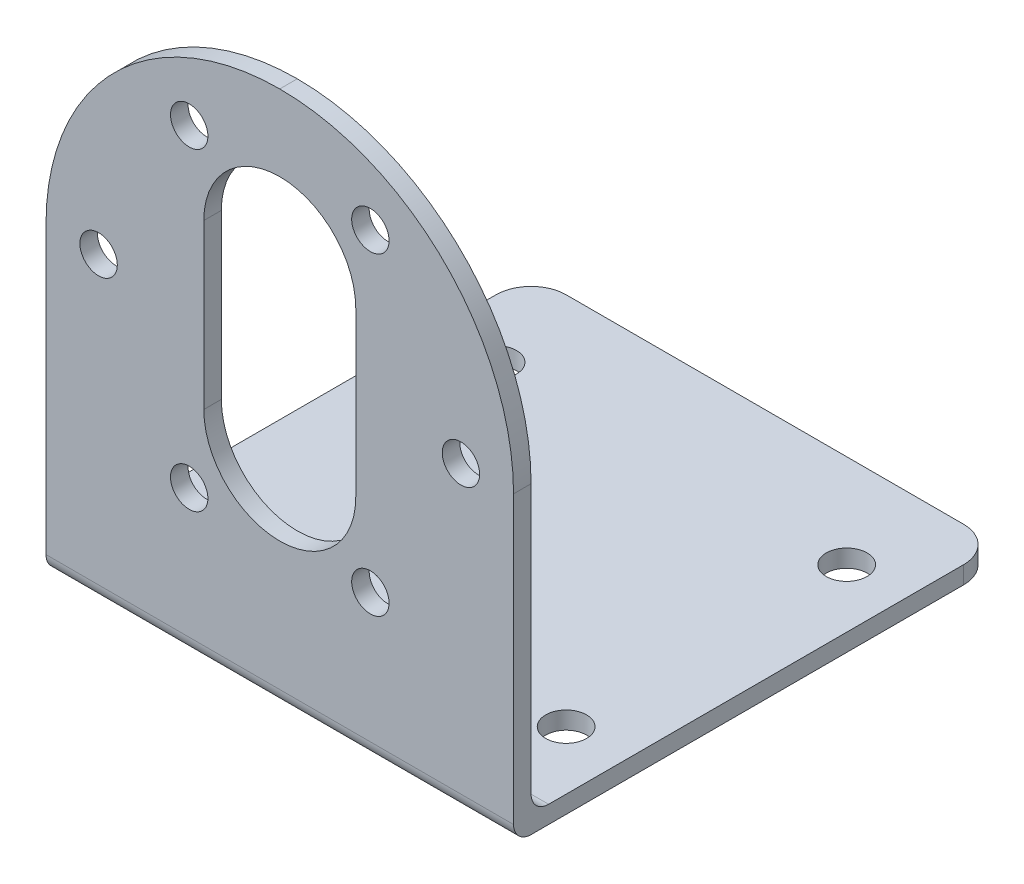
ISO-10303-21;
HEADER;
FILE_DESCRIPTION(('STEP AP214'),'2;1');
FILE_NAME('part.step','',(''),(''),'','','');
FILE_SCHEMA(('AUTOMOTIVE_DESIGN { 1 0 10303 214 1 1 1 1 }'));
ENDSEC;
DATA;
#1=APPLICATION_CONTEXT('core data for automotive mechanical design processes');
#2=APPLICATION_PROTOCOL_DEFINITION('international standard','automotive_design',2000,#1);
#3=PRODUCT_CONTEXT('',#1,'mechanical');
#4=PRODUCT('Part','Part','',(#3));
#5=PRODUCT_RELATED_PRODUCT_CATEGORY('part','',(#4));
#6=PRODUCT_DEFINITION_FORMATION('','',#4);
#7=PRODUCT_DEFINITION_CONTEXT('part definition',#1,'design');
#8=PRODUCT_DEFINITION('design','',#6,#7);
#9=PRODUCT_DEFINITION_SHAPE('','',#8);
#10=(LENGTH_UNIT() NAMED_UNIT(*) SI_UNIT(.MILLI.,.METRE.));
#11=(NAMED_UNIT(*) PLANE_ANGLE_UNIT() SI_UNIT($,.RADIAN.));
#12=(NAMED_UNIT(*) SI_UNIT($,.STERADIAN.) SOLID_ANGLE_UNIT());
#13=UNCERTAINTY_MEASURE_WITH_UNIT(LENGTH_MEASURE(1.E-05),#10,'distance_accuracy_value','');
#14=(GEOMETRIC_REPRESENTATION_CONTEXT(3) GLOBAL_UNCERTAINTY_ASSIGNED_CONTEXT((#13)) GLOBAL_UNIT_ASSIGNED_CONTEXT((#10,
#11,#12)) REPRESENTATION_CONTEXT('',''));
#15=CARTESIAN_POINT('',(0.,0.,0.));
#16=DIRECTION('',(0.,0.,1.));
#17=DIRECTION('',(1.,0.,0.));
#18=AXIS2_PLACEMENT_3D('',#15,#16,#17);
#19=CARTESIAN_POINT('',(40.,44.5,0.));
#20=DIRECTION('',(0.,0.,1.));
#21=DIRECTION('',(0.,-1.,0.));
#22=AXIS2_PLACEMENT_3D('',#19,#20,#21);
#23=PLANE('',#22);
#24=CARTESIAN_POINT('',(12.2499999999999,11.0766062413411,0.));
#25=DIRECTION('',(0.,0.,1.));
#26=DIRECTION('',(0.,-1.,0.));
#27=AXIS2_PLACEMENT_3D('',#24,#25,#26);
#28=CIRCLE('',#27,1.60000000000014);
#29=CARTESIAN_POINT('',(12.2499999999999,9.47660624134092,0.));
#30=VERTEX_POINT('',#29);
#31=EDGE_CURVE('E206',#30,#30,#28,.T.);
#32=ORIENTED_EDGE('',*,*,#31,.T.);
#33=EDGE_LOOP('',(#32));
#34=FACE_BOUND('',#33,.T.);
#35=CARTESIAN_POINT('',(27.7499999999999,11.0766062413411,0.));
#36=DIRECTION('',(0.,0.,1.));
#37=DIRECTION('',(0.,-1.,0.));
#38=AXIS2_PLACEMENT_3D('',#35,#36,#37);
#39=CIRCLE('',#38,1.6);
#40=CARTESIAN_POINT('',(27.7499999999999,9.47660624134106,0.));
#41=VERTEX_POINT('',#40);
#42=EDGE_CURVE('E203',#41,#41,#39,.T.);
#43=ORIENTED_EDGE('',*,*,#42,.T.);
#44=EDGE_LOOP('',(#43));
#45=FACE_BOUND('',#44,.T.);
#46=CARTESIAN_POINT('',(35.5,24.4999999999998,0.));
#47=DIRECTION('',(0.,0.,1.));
#48=DIRECTION('',(0.,-1.,0.));
#49=AXIS2_PLACEMENT_3D('',#46,#47,#48);
#50=CIRCLE('',#49,1.6);
#51=CARTESIAN_POINT('',(35.5,22.8999999999998,0.));
#52=VERTEX_POINT('',#51);
#53=EDGE_CURVE('E200',#52,#52,#50,.T.);
#54=ORIENTED_EDGE('',*,*,#53,.T.);
#55=EDGE_LOOP('',(#54));
#56=FACE_BOUND('',#55,.T.);
#57=CARTESIAN_POINT('',(27.7500000000001,37.9233937586587,0.));
#58=DIRECTION('',(0.,0.,1.));
#59=DIRECTION('',(0.,-1.,0.));
#60=AXIS2_PLACEMENT_3D('',#57,#58,#59);
#61=CIRCLE('',#60,1.6);
#62=CARTESIAN_POINT('',(27.7500000000001,36.3233937586587,0.));
#63=VERTEX_POINT('',#62);
#64=EDGE_CURVE('E197',#63,#63,#61,.T.);
#65=ORIENTED_EDGE('',*,*,#64,.T.);
#66=EDGE_LOOP('',(#65));
#67=FACE_BOUND('',#66,.T.);
#68=CARTESIAN_POINT('',(12.25,37.9233937586587,0.));
#69=DIRECTION('',(0.,0.,1.));
#70=DIRECTION('',(0.,-1.,0.));
#71=AXIS2_PLACEMENT_3D('',#68,#69,#70);
#72=CIRCLE('',#71,1.6);
#73=CARTESIAN_POINT('',(12.25,36.3233937586587,0.));
#74=VERTEX_POINT('',#73);
#75=EDGE_CURVE('E194',#74,#74,#72,.T.);
#76=ORIENTED_EDGE('',*,*,#75,.T.);
#77=EDGE_LOOP('',(#76));
#78=FACE_BOUND('',#77,.T.);
#79=CARTESIAN_POINT('',(4.49999999999993,24.4999999999999,0.));
#80=DIRECTION('',(0.,0.,1.));
#81=DIRECTION('',(0.,-1.,0.));
#82=AXIS2_PLACEMENT_3D('',#79,#80,#81);
#83=CIRCLE('',#82,1.60000000000009);
#84=CARTESIAN_POINT('',(4.49999999999993,22.8999999999998,0.));
#85=VERTEX_POINT('',#84);
#86=EDGE_CURVE('E191',#85,#85,#83,.T.);
#87=ORIENTED_EDGE('',*,*,#86,.T.);
#88=EDGE_LOOP('',(#87));
#89=FACE_BOUND('',#88,.T.);
#90=DIRECTION('',(0.,1.,0.));
#91=VECTOR('',#90,1.);
#92=CARTESIAN_POINT('',(26.5,44.5,0.));
#93=LINE('',#92,#91);
#94=CARTESIAN_POINT('',(26.5,17.5,0.));
#95=VERTEX_POINT('',#94);
#96=CARTESIAN_POINT('',(26.5,31.5,0.));
#97=VERTEX_POINT('',#96);
#98=EDGE_CURVE('E185',#95,#97,#93,.T.);
#99=ORIENTED_EDGE('',*,*,#98,.T.);
#100=CARTESIAN_POINT('',(20.,31.5,0.));
#101=DIRECTION('',(0.,0.,1.));
#102=DIRECTION('',(0.,-1.,0.));
#103=AXIS2_PLACEMENT_3D('',#100,#101,#102);
#104=CIRCLE('',#103,6.5);
#105=CARTESIAN_POINT('',(13.5,31.5,0.));
#106=VERTEX_POINT('',#105);
#107=EDGE_CURVE('E188',#97,#106,#104,.T.);
#108=ORIENTED_EDGE('',*,*,#107,.T.);
#109=DIRECTION('',(0.,-1.,0.));
#110=VECTOR('',#109,1.);
#111=CARTESIAN_POINT('',(13.5,44.5,0.));
#112=LINE('',#111,#110);
#113=CARTESIAN_POINT('',(13.5,17.5,0.));
#114=VERTEX_POINT('',#113);
#115=EDGE_CURVE('E180',#106,#114,#112,.T.);
#116=ORIENTED_EDGE('',*,*,#115,.T.);
#117=CARTESIAN_POINT('',(20.,17.5,0.));
#118=DIRECTION('',(0.,0.,1.));
#119=DIRECTION('',(0.,-1.,0.));
#120=AXIS2_PLACEMENT_3D('',#117,#118,#119);
#121=CIRCLE('',#120,6.5);
#122=EDGE_CURVE('E156',#114,#95,#121,.T.);
#123=ORIENTED_EDGE('',*,*,#122,.T.);
#124=EDGE_LOOP('',(#99,#108,#116,#123));
#125=FACE_BOUND('',#124,.T.);
#126=DIRECTION('',(0.,1.,0.));
#127=VECTOR('',#126,1.);
#128=CARTESIAN_POINT('',(40.,44.5,0.));
#129=LINE('',#128,#127);
#130=CARTESIAN_POINT('',(40.,1.5,0.));
#131=VERTEX_POINT('',#130);
#132=CARTESIAN_POINT('',(40.,24.5,0.));
#133=VERTEX_POINT('',#132);
#134=EDGE_CURVE('E223',#131,#133,#129,.T.);
#135=ORIENTED_EDGE('',*,*,#134,.F.);
#136=DIRECTION('',(-1.,0.,0.));
#137=VECTOR('',#136,1.);
#138=CARTESIAN_POINT('',(0.,1.5,0.));
#139=LINE('',#138,#137);
#140=CARTESIAN_POINT('',(0.,1.5,0.));
#141=VERTEX_POINT('',#140);
#142=EDGE_CURVE('E293',#131,#141,#139,.T.);
#143=ORIENTED_EDGE('',*,*,#142,.T.);
#144=DIRECTION('',(0.,1.,0.));
#145=VECTOR('',#144,1.);
#146=CARTESIAN_POINT('',(0.,44.5,0.));
#147=LINE('',#146,#145);
#148=CARTESIAN_POINT('',(0.,24.5,0.));
#149=VERTEX_POINT('',#148);
#150=EDGE_CURVE('E234',#141,#149,#147,.T.);
#151=ORIENTED_EDGE('',*,*,#150,.T.);
#152=CARTESIAN_POINT('',(20.,24.5,0.));
#153=DIRECTION('',(0.,0.,1.));
#154=DIRECTION('',(0.,-1.,0.));
#155=AXIS2_PLACEMENT_3D('',#152,#153,#154);
#156=CIRCLE('',#155,20.);
#157=CARTESIAN_POINT('',(20.,44.5,0.));
#158=VERTEX_POINT('',#157);
#159=EDGE_CURVE('E285',#149,#158,#156,.F.);
#160=ORIENTED_EDGE('',*,*,#159,.T.);
#161=CARTESIAN_POINT('',(20.,24.5,0.));
#162=DIRECTION('',(0.,0.,1.));
#163=DIRECTION('',(0.,-1.,0.));
#164=AXIS2_PLACEMENT_3D('',#161,#162,#163);
#165=CIRCLE('',#164,20.);
#166=EDGE_CURVE('E287',#158,#133,#165,.F.);
#167=ORIENTED_EDGE('',*,*,#166,.T.);
#168=EDGE_LOOP('',(#135,#143,#151,#160,#167));
#169=FACE_BOUND('',#168,.T.);
#170=ADVANCED_FACE('F40',(#34,#45,#56,#67,#78,#89,#125,#169),#23,.F.);
#171=CARTESIAN_POINT('',(40.,-1.5,1.5));
#172=DIRECTION('',(0.,0.,-1.));
#173=DIRECTION('',(-1.,0.,0.));
#174=AXIS2_PLACEMENT_3D('',#171,#172,#173);
#175=PLANE('',#174);
#176=CARTESIAN_POINT('',(12.2499999999999,11.0766062413411,1.5));
#177=DIRECTION('',(0.,0.,1.));
#178=DIRECTION('',(1.,0.,0.));
#179=AXIS2_PLACEMENT_3D('',#176,#177,#178);
#180=CIRCLE('',#179,1.60000000000014);
#181=CARTESIAN_POINT('',(13.8500000000001,11.0766062413411,1.5));
#182=VERTEX_POINT('',#181);
#183=EDGE_CURVE('E446',#182,#182,#180,.T.);
#184=ORIENTED_EDGE('',*,*,#183,.F.);
#185=EDGE_LOOP('',(#184));
#186=FACE_BOUND('',#185,.T.);
#187=CARTESIAN_POINT('',(27.7499999999999,11.0766062413411,1.5));
#188=DIRECTION('',(0.,0.,1.));
#189=DIRECTION('',(1.,0.,0.));
#190=AXIS2_PLACEMENT_3D('',#187,#188,#189);
#191=CIRCLE('',#190,1.6);
#192=CARTESIAN_POINT('',(29.3499999999999,11.0766062413411,1.5));
#193=VERTEX_POINT('',#192);
#194=EDGE_CURVE('E449',#193,#193,#191,.T.);
#195=ORIENTED_EDGE('',*,*,#194,.F.);
#196=EDGE_LOOP('',(#195));
#197=FACE_BOUND('',#196,.T.);
#198=CARTESIAN_POINT('',(35.5,24.4999999999998,1.5));
#199=DIRECTION('',(0.,0.,1.));
#200=DIRECTION('',(1.,0.,0.));
#201=AXIS2_PLACEMENT_3D('',#198,#199,#200);
#202=CIRCLE('',#201,1.6);
#203=CARTESIAN_POINT('',(37.1,24.4999999999998,1.5));
#204=VERTEX_POINT('',#203);
#205=EDGE_CURVE('E452',#204,#204,#202,.T.);
#206=ORIENTED_EDGE('',*,*,#205,.F.);
#207=EDGE_LOOP('',(#206));
#208=FACE_BOUND('',#207,.T.);
#209=CARTESIAN_POINT('',(27.7500000000001,37.9233937586587,1.5));
#210=DIRECTION('',(0.,0.,1.));
#211=DIRECTION('',(1.,0.,0.));
#212=AXIS2_PLACEMENT_3D('',#209,#210,#211);
#213=CIRCLE('',#212,1.6);
#214=CARTESIAN_POINT('',(29.3500000000001,37.9233937586587,1.5));
#215=VERTEX_POINT('',#214);
#216=EDGE_CURVE('E455',#215,#215,#213,.T.);
#217=ORIENTED_EDGE('',*,*,#216,.F.);
#218=EDGE_LOOP('',(#217));
#219=FACE_BOUND('',#218,.T.);
#220=CARTESIAN_POINT('',(12.25,37.9233937586587,1.5));
#221=DIRECTION('',(0.,0.,1.));
#222=DIRECTION('',(1.,0.,0.));
#223=AXIS2_PLACEMENT_3D('',#220,#221,#222);
#224=CIRCLE('',#223,1.6);
#225=CARTESIAN_POINT('',(13.85,37.9233937586587,1.5));
#226=VERTEX_POINT('',#225);
#227=EDGE_CURVE('E443',#226,#226,#224,.T.);
#228=ORIENTED_EDGE('',*,*,#227,.F.);
#229=EDGE_LOOP('',(#228));
#230=FACE_BOUND('',#229,.T.);
#231=CARTESIAN_POINT('',(4.49999999999993,24.4999999999999,1.5));
#232=DIRECTION('',(0.,0.,1.));
#233=DIRECTION('',(1.,0.,0.));
#234=AXIS2_PLACEMENT_3D('',#231,#232,#233);
#235=CIRCLE('',#234,1.60000000000009);
#236=CARTESIAN_POINT('',(6.10000000000002,24.4999999999999,1.5));
#237=VERTEX_POINT('',#236);
#238=EDGE_CURVE('E438',#237,#237,#235,.T.);
#239=ORIENTED_EDGE('',*,*,#238,.F.);
#240=EDGE_LOOP('',(#239));
#241=FACE_BOUND('',#240,.T.);
#242=DIRECTION('',(0.,-1.,0.));
#243=VECTOR('',#242,1.);
#244=CARTESIAN_POINT('',(13.5,31.5,1.5));
#245=LINE('',#244,#243);
#246=CARTESIAN_POINT('',(13.5,31.5,1.5));
#247=VERTEX_POINT('',#246);
#248=CARTESIAN_POINT('',(13.5,17.5,1.5));
#249=VERTEX_POINT('',#248);
#250=EDGE_CURVE('E164',#247,#249,#245,.T.);
#251=ORIENTED_EDGE('',*,*,#250,.F.);
#252=CARTESIAN_POINT('',(20.,31.5,1.5));
#253=DIRECTION('',(0.,0.,1.));
#254=DIRECTION('',(1.,0.,0.));
#255=AXIS2_PLACEMENT_3D('',#252,#253,#254);
#256=CIRCLE('',#255,6.5);
#257=CARTESIAN_POINT('',(26.5,31.5,1.5));
#258=VERTEX_POINT('',#257);
#259=EDGE_CURVE('E169',#258,#247,#256,.T.);
#260=ORIENTED_EDGE('',*,*,#259,.F.);
#261=DIRECTION('',(0.,1.,0.));
#262=VECTOR('',#261,1.);
#263=CARTESIAN_POINT('',(26.5,31.5,1.5));
#264=LINE('',#263,#262);
#265=CARTESIAN_POINT('',(26.5,17.5,1.5));
#266=VERTEX_POINT('',#265);
#267=EDGE_CURVE('E173',#266,#258,#264,.T.);
#268=ORIENTED_EDGE('',*,*,#267,.F.);
#269=CARTESIAN_POINT('',(20.,17.5,1.5));
#270=DIRECTION('',(0.,0.,1.));
#271=DIRECTION('',(-1.,0.,0.));
#272=AXIS2_PLACEMENT_3D('',#269,#270,#271);
#273=CIRCLE('',#272,6.5);
#274=EDGE_CURVE('E153',#249,#266,#273,.T.);
#275=ORIENTED_EDGE('',*,*,#274,.F.);
#276=EDGE_LOOP('',(#251,#260,#268,#275));
#277=FACE_BOUND('',#276,.T.);
#278=DIRECTION('',(0.,-1.,0.));
#279=VECTOR('',#278,1.);
#280=CARTESIAN_POINT('',(0.,-1.5,1.5));
#281=LINE('',#280,#279);
#282=CARTESIAN_POINT('',(0.,24.5,1.5));
#283=VERTEX_POINT('',#282);
#284=CARTESIAN_POINT('',(0.,0.,1.5));
#285=VERTEX_POINT('',#284);
#286=EDGE_CURVE('E236',#283,#285,#281,.T.);
#287=ORIENTED_EDGE('',*,*,#286,.T.);
#288=DIRECTION('',(-1.,0.,0.));
#289=VECTOR('',#288,1.);
#290=CARTESIAN_POINT('',(40.,0.,1.5));
#291=LINE('',#290,#289);
#292=CARTESIAN_POINT('',(40.,0.,1.5));
#293=VERTEX_POINT('',#292);
#294=EDGE_CURVE('E55',#285,#293,#291,.F.);
#295=ORIENTED_EDGE('',*,*,#294,.T.);
#296=DIRECTION('',(0.,-1.,0.));
#297=VECTOR('',#296,1.);
#298=CARTESIAN_POINT('',(40.,-1.5,1.5));
#299=LINE('',#298,#297);
#300=CARTESIAN_POINT('',(40.,24.5,1.5));
#301=VERTEX_POINT('',#300);
#302=EDGE_CURVE('E225',#301,#293,#299,.T.);
#303=ORIENTED_EDGE('',*,*,#302,.F.);
#304=CARTESIAN_POINT('',(20.,24.5,1.5));
#305=DIRECTION('',(0.,0.,-1.));
#306=DIRECTION('',(-1.,0.,0.));
#307=AXIS2_PLACEMENT_3D('',#304,#305,#306);
#308=CIRCLE('',#307,20.);
#309=CARTESIAN_POINT('',(20.,44.5,1.5));
#310=VERTEX_POINT('',#309);
#311=EDGE_CURVE('E283',#301,#310,#308,.F.);
#312=ORIENTED_EDGE('',*,*,#311,.T.);
#313=CARTESIAN_POINT('',(20.,24.5,1.5));
#314=DIRECTION('',(0.,0.,-1.));
#315=DIRECTION('',(-1.,0.,0.));
#316=AXIS2_PLACEMENT_3D('',#313,#314,#315);
#317=CIRCLE('',#316,20.);
#318=EDGE_CURVE('E281',#310,#283,#317,.F.);
#319=ORIENTED_EDGE('',*,*,#318,.T.);
#320=EDGE_LOOP('',(#287,#295,#303,#312,#319));
#321=FACE_BOUND('',#320,.T.);
#322=ADVANCED_FACE('F171',(#186,#197,#208,#219,#230,#241,#277,#321),#175,.F.);
#323=CARTESIAN_POINT('',(40.,-1.5,-40.));
#324=DIRECTION('',(0.,1.,0.));
#325=DIRECTION('',(0.,0.,1.));
#326=AXIS2_PLACEMENT_3D('',#323,#324,#325);
#327=PLANE('',#326);
#328=CARTESIAN_POINT('',(35.,-1.5,-32.));
#329=DIRECTION('',(0.,-1.,0.));
#330=DIRECTION('',(0.,0.,1.));
#331=AXIS2_PLACEMENT_3D('',#328,#329,#330);
#332=CIRCLE('',#331,1.75);
#333=CARTESIAN_POINT('',(35.,-1.5,-30.25));
#334=VERTEX_POINT('',#333);
#335=EDGE_CURVE('E217',#334,#334,#332,.T.);
#336=ORIENTED_EDGE('',*,*,#335,.F.);
#337=EDGE_LOOP('',(#336));
#338=FACE_BOUND('',#337,.T.);
#339=CARTESIAN_POINT('',(35.,-1.5,-8.));
#340=DIRECTION('',(0.,-1.,0.));
#341=DIRECTION('',(0.,0.,1.));
#342=AXIS2_PLACEMENT_3D('',#339,#340,#341);
#343=CIRCLE('',#342,1.75);
#344=CARTESIAN_POINT('',(35.,-1.5,-6.24999999999999));
#345=VERTEX_POINT('',#344);
#346=EDGE_CURVE('E214',#345,#345,#343,.T.);
#347=ORIENTED_EDGE('',*,*,#346,.F.);
#348=EDGE_LOOP('',(#347));
#349=FACE_BOUND('',#348,.T.);
#350=CARTESIAN_POINT('',(5.,-1.5,-8.));
#351=DIRECTION('',(0.,-1.,0.));
#352=DIRECTION('',(0.,0.,-1.));
#353=AXIS2_PLACEMENT_3D('',#350,#351,#352);
#354=CIRCLE('',#353,1.75);
#355=CARTESIAN_POINT('',(5.,-1.5,-9.75));
#356=VERTEX_POINT('',#355);
#357=EDGE_CURVE('E210',#356,#356,#354,.T.);
#358=ORIENTED_EDGE('',*,*,#357,.F.);
#359=EDGE_LOOP('',(#358));
#360=FACE_BOUND('',#359,.T.);
#361=CARTESIAN_POINT('',(5.,-1.5,-32.));
#362=DIRECTION('',(0.,-1.,0.));
#363=DIRECTION('',(0.,0.,-1.));
#364=AXIS2_PLACEMENT_3D('',#361,#362,#363);
#365=CIRCLE('',#364,1.75);
#366=CARTESIAN_POINT('',(5.,-1.5,-33.75));
#367=VERTEX_POINT('',#366);
#368=EDGE_CURVE('E213',#367,#367,#365,.T.);
#369=ORIENTED_EDGE('',*,*,#368,.F.);
#370=EDGE_LOOP('',(#369));
#371=FACE_BOUND('',#370,.T.);
#372=DIRECTION('',(0.,0.,-1.));
#373=VECTOR('',#372,1.);
#374=CARTESIAN_POINT('',(40.,-1.5,-40.));
#375=LINE('',#374,#373);
#376=CARTESIAN_POINT('',(40.,-1.5,0.));
#377=VERTEX_POINT('',#376);
#378=CARTESIAN_POINT('',(40.,-1.5,-37.));
#379=VERTEX_POINT('',#378);
#380=EDGE_CURVE('E228',#377,#379,#375,.T.);
#381=ORIENTED_EDGE('',*,*,#380,.F.);
#382=DIRECTION('',(-1.,0.,0.));
#383=VECTOR('',#382,1.);
#384=CARTESIAN_POINT('',(40.,-1.5,0.));
#385=LINE('',#384,#383);
#386=CARTESIAN_POINT('',(0.,-1.5,0.));
#387=VERTEX_POINT('',#386);
#388=EDGE_CURVE('E300',#377,#387,#385,.T.);
#389=ORIENTED_EDGE('',*,*,#388,.T.);
#390=DIRECTION('',(0.,0.,-1.));
#391=VECTOR('',#390,1.);
#392=CARTESIAN_POINT('',(0.,-1.5,-40.));
#393=LINE('',#392,#391);
#394=CARTESIAN_POINT('',(0.,-1.5,-37.));
#395=VERTEX_POINT('',#394);
#396=EDGE_CURVE('E239',#387,#395,#393,.T.);
#397=ORIENTED_EDGE('',*,*,#396,.T.);
#398=CARTESIAN_POINT('',(3.,-1.5,-37.));
#399=DIRECTION('',(0.,1.,0.));
#400=DIRECTION('',(0.,0.,1.));
#401=AXIS2_PLACEMENT_3D('',#398,#399,#400);
#402=CIRCLE('',#401,3.);
#403=CARTESIAN_POINT('',(3.,-1.5,-40.));
#404=VERTEX_POINT('',#403);
#405=EDGE_CURVE('E270',#395,#404,#402,.F.);
#406=ORIENTED_EDGE('',*,*,#405,.T.);
#407=DIRECTION('',(-1.,0.,0.));
#408=VECTOR('',#407,1.);
#409=CARTESIAN_POINT('',(40.,-1.5,-40.));
#410=LINE('',#409,#408);
#411=CARTESIAN_POINT('',(37.,-1.5,-40.));
#412=VERTEX_POINT('',#411);
#413=EDGE_CURVE('E245',#412,#404,#410,.T.);
#414=ORIENTED_EDGE('',*,*,#413,.F.);
#415=CARTESIAN_POINT('',(37.,-1.5,-37.));
#416=DIRECTION('',(0.,1.,0.));
#417=DIRECTION('',(0.,0.,1.));
#418=AXIS2_PLACEMENT_3D('',#415,#416,#417);
#419=CIRCLE('',#418,3.);
#420=EDGE_CURVE('E272',#412,#379,#419,.F.);
#421=ORIENTED_EDGE('',*,*,#420,.T.);
#422=EDGE_LOOP('',(#381,#389,#397,#406,#414,#421));
#423=FACE_BOUND('',#422,.T.);
#424=ADVANCED_FACE('F337',(#338,#349,#360,#371,#423),#327,.F.);
#425=CARTESIAN_POINT('',(40.,0.,-40.));
#426=DIRECTION('',(0.,0.,1.));
#427=DIRECTION('',(1.,0.,0.));
#428=AXIS2_PLACEMENT_3D('',#425,#426,#427);
#429=PLANE('',#428);
#430=DIRECTION('',(-1.,0.,0.));
#431=VECTOR('',#430,1.);
#432=CARTESIAN_POINT('',(40.,0.,-40.));
#433=LINE('',#432,#431);
#434=CARTESIAN_POINT('',(37.,0.,-40.));
#435=VERTEX_POINT('',#434);
#436=CARTESIAN_POINT('',(3.,0.,-40.));
#437=VERTEX_POINT('',#436);
#438=EDGE_CURVE('E233',#435,#437,#433,.T.);
#439=ORIENTED_EDGE('',*,*,#438,.F.);
#440=DIRECTION('',(0.,1.,0.));
#441=VECTOR('',#440,1.);
#442=CARTESIAN_POINT('',(37.,-1.5,-40.));
#443=LINE('',#442,#441);
#444=EDGE_CURVE('E268',#435,#412,#443,.F.);
#445=ORIENTED_EDGE('',*,*,#444,.T.);
#446=ORIENTED_EDGE('',*,*,#413,.T.);
#447=DIRECTION('',(0.,1.,0.));
#448=VECTOR('',#447,1.);
#449=CARTESIAN_POINT('',(3.,0.,-40.));
#450=LINE('',#449,#448);
#451=EDGE_CURVE('E265',#404,#437,#450,.T.);
#452=ORIENTED_EDGE('',*,*,#451,.T.);
#453=EDGE_LOOP('',(#439,#445,#446,#452));
#454=FACE_BOUND('',#453,.T.);
#455=ADVANCED_FACE('F346',(#454),#429,.F.);
#456=CARTESIAN_POINT('',(40.,0.,0.));
#457=DIRECTION('',(0.,-1.,0.));
#458=DIRECTION('',(0.,0.,-1.));
#459=AXIS2_PLACEMENT_3D('',#456,#457,#458);
#460=PLANE('',#459);
#461=CARTESIAN_POINT('',(35.,0.,-32.));
#462=DIRECTION('',(0.,-1.,0.));
#463=DIRECTION('',(0.,0.,-1.));
#464=AXIS2_PLACEMENT_3D('',#461,#462,#463);
#465=CIRCLE('',#464,1.75);
#466=CARTESIAN_POINT('',(35.,0.,-33.75));
#467=VERTEX_POINT('',#466);
#468=EDGE_CURVE('E237',#467,#467,#465,.T.);
#469=ORIENTED_EDGE('',*,*,#468,.T.);
#470=EDGE_LOOP('',(#469));
#471=FACE_BOUND('',#470,.T.);
#472=CARTESIAN_POINT('',(35.,0.,-8.));
#473=DIRECTION('',(0.,-1.,0.));
#474=DIRECTION('',(0.,0.,-1.));
#475=AXIS2_PLACEMENT_3D('',#472,#473,#474);
#476=CIRCLE('',#475,1.75);
#477=CARTESIAN_POINT('',(35.,0.,-9.75));
#478=VERTEX_POINT('',#477);
#479=EDGE_CURVE('E254',#478,#478,#476,.T.);
#480=ORIENTED_EDGE('',*,*,#479,.T.);
#481=EDGE_LOOP('',(#480));
#482=FACE_BOUND('',#481,.T.);
#483=CARTESIAN_POINT('',(5.,0.,-8.));
#484=DIRECTION('',(0.,-1.,0.));
#485=DIRECTION('',(0.,0.,-1.));
#486=AXIS2_PLACEMENT_3D('',#483,#484,#485);
#487=CIRCLE('',#486,1.75);
#488=CARTESIAN_POINT('',(5.,0.,-9.75));
#489=VERTEX_POINT('',#488);
#490=EDGE_CURVE('E251',#489,#489,#487,.T.);
#491=ORIENTED_EDGE('',*,*,#490,.T.);
#492=EDGE_LOOP('',(#491));
#493=FACE_BOUND('',#492,.T.);
#494=CARTESIAN_POINT('',(5.,0.,-32.));
#495=DIRECTION('',(0.,-1.,0.));
#496=DIRECTION('',(0.,0.,-1.));
#497=AXIS2_PLACEMENT_3D('',#494,#495,#496);
#498=CIRCLE('',#497,1.75);
#499=CARTESIAN_POINT('',(5.,0.,-33.75));
#500=VERTEX_POINT('',#499);
#501=EDGE_CURVE('E222',#500,#500,#498,.T.);
#502=ORIENTED_EDGE('',*,*,#501,.T.);
#503=EDGE_LOOP('',(#502));
#504=FACE_BOUND('',#503,.T.);
#505=DIRECTION('',(0.,0.,1.));
#506=VECTOR('',#505,1.);
#507=CARTESIAN_POINT('',(0.,0.,0.));
#508=LINE('',#507,#506);
#509=CARTESIAN_POINT('',(0.,0.,-37.));
#510=VERTEX_POINT('',#509);
#511=CARTESIAN_POINT('',(0.,0.,-1.5));
#512=VERTEX_POINT('',#511);
#513=EDGE_CURVE('E226',#510,#512,#508,.T.);
#514=ORIENTED_EDGE('',*,*,#513,.T.);
#515=DIRECTION('',(-1.,0.,0.));
#516=VECTOR('',#515,1.);
#517=CARTESIAN_POINT('',(40.,0.,-1.5));
#518=LINE('',#517,#516);
#519=CARTESIAN_POINT('',(40.,0.,-1.5));
#520=VERTEX_POINT('',#519);
#521=EDGE_CURVE('E298',#512,#520,#518,.F.);
#522=ORIENTED_EDGE('',*,*,#521,.T.);
#523=DIRECTION('',(0.,0.,1.));
#524=VECTOR('',#523,1.);
#525=CARTESIAN_POINT('',(40.,0.,0.));
#526=LINE('',#525,#524);
#527=CARTESIAN_POINT('',(40.,0.,-37.));
#528=VERTEX_POINT('',#527);
#529=EDGE_CURVE('E230',#528,#520,#526,.T.);
#530=ORIENTED_EDGE('',*,*,#529,.F.);
#531=CARTESIAN_POINT('',(37.,0.,-37.));
#532=DIRECTION('',(0.,-1.,0.));
#533=DIRECTION('',(0.,0.,-1.));
#534=AXIS2_PLACEMENT_3D('',#531,#532,#533);
#535=CIRCLE('',#534,3.);
#536=EDGE_CURVE('E263',#528,#435,#535,.F.);
#537=ORIENTED_EDGE('',*,*,#536,.T.);
#538=ORIENTED_EDGE('',*,*,#438,.T.);
#539=CARTESIAN_POINT('',(3.,0.,-37.));
#540=DIRECTION('',(0.,-1.,0.));
#541=DIRECTION('',(0.,0.,-1.));
#542=AXIS2_PLACEMENT_3D('',#539,#540,#541);
#543=CIRCLE('',#542,3.);
#544=EDGE_CURVE('E261',#437,#510,#543,.F.);
#545=ORIENTED_EDGE('',*,*,#544,.T.);
#546=EDGE_LOOP('',(#514,#522,#530,#537,#538,#545));
#547=FACE_BOUND('',#546,.T.);
#548=ADVANCED_FACE('F314',(#471,#482,#493,#504,#547),#460,.F.);
#549=CARTESIAN_POINT('',(40.,0.,0.));
#550=DIRECTION('',(1.,0.,0.));
#551=DIRECTION('',(0.,0.,-1.));
#552=AXIS2_PLACEMENT_3D('',#549,#550,#551);
#553=PLANE('',#552);
#554=ORIENTED_EDGE('',*,*,#302,.T.);
#555=CARTESIAN_POINT('',(40.,0.,0.));
#556=DIRECTION('',(1.,0.,0.));
#557=DIRECTION('',(0.,0.,-1.));
#558=AXIS2_PLACEMENT_3D('',#555,#556,#557);
#559=CIRCLE('',#558,1.5);
#560=EDGE_CURVE('E305',#293,#377,#559,.T.);
#561=ORIENTED_EDGE('',*,*,#560,.T.);
#562=ORIENTED_EDGE('',*,*,#380,.T.);
#563=DIRECTION('',(0.,1.,0.));
#564=VECTOR('',#563,1.);
#565=CARTESIAN_POINT('',(40.,0.,-37.));
#566=LINE('',#565,#564);
#567=EDGE_CURVE('E248',#379,#528,#566,.T.);
#568=ORIENTED_EDGE('',*,*,#567,.T.);
#569=ORIENTED_EDGE('',*,*,#529,.T.);
#570=CARTESIAN_POINT('',(40.,1.5,-1.5));
#571=DIRECTION('',(1.,0.,0.));
#572=DIRECTION('',(0.,0.,-1.));
#573=AXIS2_PLACEMENT_3D('',#570,#571,#572);
#574=CIRCLE('',#573,1.5);
#575=EDGE_CURVE('E11',#520,#131,#574,.F.);
#576=ORIENTED_EDGE('',*,*,#575,.T.);
#577=ORIENTED_EDGE('',*,*,#134,.T.);
#578=DIRECTION('',(0.,0.,1.));
#579=VECTOR('',#578,1.);
#580=CARTESIAN_POINT('',(40.,24.5,1.5));
#581=LINE('',#580,#579);
#582=EDGE_CURVE('E278',#133,#301,#581,.T.);
#583=ORIENTED_EDGE('',*,*,#582,.T.);
#584=EDGE_LOOP('',(#554,#561,#562,#568,#569,#576,#577,#583));
#585=FACE_BOUND('',#584,.T.);
#586=ADVANCED_FACE('F320',(#585),#553,.T.);
#587=CARTESIAN_POINT('',(0.,0.,0.));
#588=DIRECTION('',(1.,0.,0.));
#589=DIRECTION('',(0.,0.,-1.));
#590=AXIS2_PLACEMENT_3D('',#587,#588,#589);
#591=PLANE('',#590);
#592=ORIENTED_EDGE('',*,*,#396,.F.);
#593=CARTESIAN_POINT('',(0.,0.,0.));
#594=DIRECTION('',(1.,0.,0.));
#595=DIRECTION('',(0.,0.,-1.));
#596=AXIS2_PLACEMENT_3D('',#593,#594,#595);
#597=CIRCLE('',#596,1.5);
#598=EDGE_CURVE('E63',#387,#285,#597,.F.);
#599=ORIENTED_EDGE('',*,*,#598,.T.);
#600=ORIENTED_EDGE('',*,*,#286,.F.);
#601=DIRECTION('',(0.,0.,1.));
#602=VECTOR('',#601,1.);
#603=CARTESIAN_POINT('',(0.,24.5,0.));
#604=LINE('',#603,#602);
#605=EDGE_CURVE('E290',#283,#149,#604,.F.);
#606=ORIENTED_EDGE('',*,*,#605,.T.);
#607=ORIENTED_EDGE('',*,*,#150,.F.);
#608=CARTESIAN_POINT('',(0.,1.5,-1.5));
#609=DIRECTION('',(1.,0.,0.));
#610=DIRECTION('',(0.,0.,-1.));
#611=AXIS2_PLACEMENT_3D('',#608,#609,#610);
#612=CIRCLE('',#611,1.5);
#613=EDGE_CURVE('E48',#141,#512,#612,.T.);
#614=ORIENTED_EDGE('',*,*,#613,.T.);
#615=ORIENTED_EDGE('',*,*,#513,.F.);
#616=DIRECTION('',(0.,1.,0.));
#617=VECTOR('',#616,1.);
#618=CARTESIAN_POINT('',(0.,0.,-37.));
#619=LINE('',#618,#617);
#620=EDGE_CURVE('E275',#510,#395,#619,.F.);
#621=ORIENTED_EDGE('',*,*,#620,.T.);
#622=EDGE_LOOP('',(#592,#599,#600,#606,#607,#614,#615,#621));
#623=FACE_BOUND('',#622,.T.);
#624=ADVANCED_FACE('F308',(#623),#591,.F.);
#625=CARTESIAN_POINT('',(5.,38.5,-32.));
#626=DIRECTION('',(0.,-1.,0.));
#627=DIRECTION('',(0.,0.,-1.));
#628=AXIS2_PLACEMENT_3D('',#625,#626,#627);
#629=CYLINDRICAL_SURFACE('',#628,1.75);
#630=ORIENTED_EDGE('',*,*,#368,.T.);
#631=EDGE_LOOP('',(#630));
#632=FACE_BOUND('',#631,.T.);
#633=ORIENTED_EDGE('',*,*,#501,.F.);
#634=EDGE_LOOP('',(#633));
#635=FACE_BOUND('',#634,.T.);
#636=ADVANCED_FACE('F381',(#632,#635),#629,.F.);
#637=CARTESIAN_POINT('',(5.,38.5,-8.));
#638=DIRECTION('',(0.,-1.,0.));
#639=DIRECTION('',(0.,0.,-1.));
#640=AXIS2_PLACEMENT_3D('',#637,#638,#639);
#641=CYLINDRICAL_SURFACE('',#640,1.75);
#642=ORIENTED_EDGE('',*,*,#357,.T.);
#643=EDGE_LOOP('',(#642));
#644=FACE_BOUND('',#643,.T.);
#645=ORIENTED_EDGE('',*,*,#490,.F.);
#646=EDGE_LOOP('',(#645));
#647=FACE_BOUND('',#646,.T.);
#648=ADVANCED_FACE('F386',(#644,#647),#641,.F.);
#649=CARTESIAN_POINT('',(35.,38.5,-7.99999999999999));
#650=DIRECTION('',(0.,-1.,0.));
#651=DIRECTION('',(0.,0.,-1.));
#652=AXIS2_PLACEMENT_3D('',#649,#650,#651);
#653=CYLINDRICAL_SURFACE('',#652,1.75);
#654=ORIENTED_EDGE('',*,*,#346,.T.);
#655=EDGE_LOOP('',(#654));
#656=FACE_BOUND('',#655,.T.);
#657=ORIENTED_EDGE('',*,*,#479,.F.);
#658=EDGE_LOOP('',(#657));
#659=FACE_BOUND('',#658,.T.);
#660=ADVANCED_FACE('F390',(#656,#659),#653,.F.);
#661=CARTESIAN_POINT('',(35.,38.5,-32.));
#662=DIRECTION('',(0.,-1.,0.));
#663=DIRECTION('',(0.,0.,-1.));
#664=AXIS2_PLACEMENT_3D('',#661,#662,#663);
#665=CYLINDRICAL_SURFACE('',#664,1.75);
#666=ORIENTED_EDGE('',*,*,#335,.T.);
#667=EDGE_LOOP('',(#666));
#668=FACE_BOUND('',#667,.T.);
#669=ORIENTED_EDGE('',*,*,#468,.F.);
#670=EDGE_LOOP('',(#669));
#671=FACE_BOUND('',#670,.T.);
#672=ADVANCED_FACE('F358',(#668,#671),#665,.F.);
#673=CARTESIAN_POINT('',(37.,0.,-37.));
#674=DIRECTION('',(0.,-1.,0.));
#675=DIRECTION('',(0.,0.,-1.));
#676=AXIS2_PLACEMENT_3D('',#673,#674,#675);
#677=CYLINDRICAL_SURFACE('',#676,3.);
#678=ORIENTED_EDGE('',*,*,#420,.F.);
#679=ORIENTED_EDGE('',*,*,#444,.F.);
#680=ORIENTED_EDGE('',*,*,#536,.F.);
#681=ORIENTED_EDGE('',*,*,#567,.F.);
#682=EDGE_LOOP('',(#678,#679,#680,#681));
#683=FACE_BOUND('',#682,.T.);
#684=ADVANCED_FACE('F343',(#683),#677,.T.);
#685=CARTESIAN_POINT('',(3.,0.,-37.));
#686=DIRECTION('',(0.,1.,0.));
#687=DIRECTION('',(0.,0.,1.));
#688=AXIS2_PLACEMENT_3D('',#685,#686,#687);
#689=CYLINDRICAL_SURFACE('',#688,3.);
#690=ORIENTED_EDGE('',*,*,#405,.F.);
#691=ORIENTED_EDGE('',*,*,#620,.F.);
#692=ORIENTED_EDGE('',*,*,#544,.F.);
#693=ORIENTED_EDGE('',*,*,#451,.F.);
#694=EDGE_LOOP('',(#690,#691,#692,#693));
#695=FACE_BOUND('',#694,.T.);
#696=ADVANCED_FACE('F350',(#695),#689,.T.);
#697=CARTESIAN_POINT('',(20.,24.5,1.5));
#698=DIRECTION('',(0.,0.,1.));
#699=DIRECTION('',(1.,0.,0.));
#700=AXIS2_PLACEMENT_3D('',#697,#698,#699);
#701=CYLINDRICAL_SURFACE('',#700,20.);
#702=DIRECTION('',(0.,0.,1.));
#703=VECTOR('',#702,1.);
#704=CARTESIAN_POINT('',(20.,44.5,1.5));
#705=LINE('',#704,#703);
#706=EDGE_CURVE('E209',#158,#310,#705,.T.);
#707=ORIENTED_EDGE('',*,*,#706,.F.);
#708=ORIENTED_EDGE('',*,*,#159,.F.);
#709=ORIENTED_EDGE('',*,*,#605,.F.);
#710=ORIENTED_EDGE('',*,*,#318,.F.);
#711=EDGE_LOOP('',(#707,#708,#709,#710));
#712=FACE_BOUND('',#711,.T.);
#713=ADVANCED_FACE('F332',(#712),#701,.T.);
#714=CARTESIAN_POINT('',(20.,24.5,0.));
#715=DIRECTION('',(0.,0.,-1.));
#716=DIRECTION('',(-1.,0.,0.));
#717=AXIS2_PLACEMENT_3D('',#714,#715,#716);
#718=CYLINDRICAL_SURFACE('',#717,20.);
#719=ORIENTED_EDGE('',*,*,#166,.F.);
#720=ORIENTED_EDGE('',*,*,#706,.T.);
#721=ORIENTED_EDGE('',*,*,#311,.F.);
#722=ORIENTED_EDGE('',*,*,#582,.F.);
#723=EDGE_LOOP('',(#719,#720,#721,#722));
#724=FACE_BOUND('',#723,.T.);
#725=ADVANCED_FACE('F327',(#724),#718,.T.);
#726=CARTESIAN_POINT('',(20.,31.5,-38.5));
#727=DIRECTION('',(0.,0.,1.));
#728=DIRECTION('',(1.,0.,0.));
#729=AXIS2_PLACEMENT_3D('',#726,#727,#728);
#730=CYLINDRICAL_SURFACE('',#729,6.5);
#731=DIRECTION('',(0.,0.,1.));
#732=VECTOR('',#731,1.);
#733=CARTESIAN_POINT('',(26.5,31.5,-38.5));
#734=LINE('',#733,#732);
#735=EDGE_CURVE('E178',#97,#258,#734,.T.);
#736=ORIENTED_EDGE('',*,*,#735,.T.);
#737=ORIENTED_EDGE('',*,*,#259,.T.);
#738=DIRECTION('',(0.,0.,1.));
#739=VECTOR('',#738,1.);
#740=CARTESIAN_POINT('',(13.5,31.5,-38.5));
#741=LINE('',#740,#739);
#742=EDGE_CURVE('E160',#106,#247,#741,.T.);
#743=ORIENTED_EDGE('',*,*,#742,.F.);
#744=ORIENTED_EDGE('',*,*,#107,.F.);
#745=EDGE_LOOP('',(#736,#737,#743,#744));
#746=FACE_BOUND('',#745,.T.);
#747=ADVANCED_FACE('F398',(#746),#730,.F.);
#748=CARTESIAN_POINT('',(26.5,31.5,-38.5));
#749=DIRECTION('',(1.,0.,0.));
#750=DIRECTION('',(0.,0.,-1.));
#751=AXIS2_PLACEMENT_3D('',#748,#749,#750);
#752=PLANE('',#751);
#753=DIRECTION('',(0.,0.,1.));
#754=VECTOR('',#753,1.);
#755=CARTESIAN_POINT('',(26.5,17.5,-38.5));
#756=LINE('',#755,#754);
#757=EDGE_CURVE('E159',#95,#266,#756,.T.);
#758=ORIENTED_EDGE('',*,*,#757,.T.);
#759=ORIENTED_EDGE('',*,*,#267,.T.);
#760=ORIENTED_EDGE('',*,*,#735,.F.);
#761=ORIENTED_EDGE('',*,*,#98,.F.);
#762=EDGE_LOOP('',(#758,#759,#760,#761));
#763=FACE_BOUND('',#762,.T.);
#764=ADVANCED_FACE('F401',(#763),#752,.F.);
#765=CARTESIAN_POINT('',(20.,17.5,-38.5));
#766=DIRECTION('',(0.,0.,1.));
#767=DIRECTION('',(1.,0.,0.));
#768=AXIS2_PLACEMENT_3D('',#765,#766,#767);
#769=CYLINDRICAL_SURFACE('',#768,6.5);
#770=DIRECTION('',(0.,0.,1.));
#771=VECTOR('',#770,1.);
#772=CARTESIAN_POINT('',(13.5,17.5,-38.5));
#773=LINE('',#772,#771);
#774=EDGE_CURVE('E148',#114,#249,#773,.T.);
#775=ORIENTED_EDGE('',*,*,#774,.T.);
#776=ORIENTED_EDGE('',*,*,#274,.T.);
#777=ORIENTED_EDGE('',*,*,#757,.F.);
#778=ORIENTED_EDGE('',*,*,#122,.F.);
#779=EDGE_LOOP('',(#775,#776,#777,#778));
#780=FACE_BOUND('',#779,.T.);
#781=ADVANCED_FACE('F150',(#780),#769,.F.);
#782=CARTESIAN_POINT('',(13.5,31.5,-38.5));
#783=DIRECTION('',(-1.,0.,0.));
#784=DIRECTION('',(0.,0.,1.));
#785=AXIS2_PLACEMENT_3D('',#782,#783,#784);
#786=PLANE('',#785);
#787=ORIENTED_EDGE('',*,*,#742,.T.);
#788=ORIENTED_EDGE('',*,*,#250,.T.);
#789=ORIENTED_EDGE('',*,*,#774,.F.);
#790=ORIENTED_EDGE('',*,*,#115,.F.);
#791=EDGE_LOOP('',(#787,#788,#789,#790));
#792=FACE_BOUND('',#791,.T.);
#793=ADVANCED_FACE('F165',(#792),#786,.F.);
#794=CARTESIAN_POINT('',(4.49999999999993,24.4999999999999,-38.5));
#795=DIRECTION('',(0.,0.,1.));
#796=DIRECTION('',(1.,0.,0.));
#797=AXIS2_PLACEMENT_3D('',#794,#795,#796);
#798=CYLINDRICAL_SURFACE('',#797,1.60000000000009);
#799=ORIENTED_EDGE('',*,*,#238,.T.);
#800=EDGE_LOOP('',(#799));
#801=FACE_BOUND('',#800,.T.);
#802=ORIENTED_EDGE('',*,*,#86,.F.);
#803=EDGE_LOOP('',(#802));
#804=FACE_BOUND('',#803,.T.);
#805=ADVANCED_FACE('F405',(#801,#804),#798,.F.);
#806=CARTESIAN_POINT('',(12.25,37.9233937586587,-38.5));
#807=DIRECTION('',(0.,0.,1.));
#808=DIRECTION('',(1.,0.,0.));
#809=AXIS2_PLACEMENT_3D('',#806,#807,#808);
#810=CYLINDRICAL_SURFACE('',#809,1.6);
#811=ORIENTED_EDGE('',*,*,#227,.T.);
#812=EDGE_LOOP('',(#811));
#813=FACE_BOUND('',#812,.T.);
#814=ORIENTED_EDGE('',*,*,#75,.F.);
#815=EDGE_LOOP('',(#814));
#816=FACE_BOUND('',#815,.T.);
#817=ADVANCED_FACE('F426',(#813,#816),#810,.F.);
#818=CARTESIAN_POINT('',(27.7500000000001,37.9233937586587,-38.5));
#819=DIRECTION('',(0.,0.,1.));
#820=DIRECTION('',(1.,0.,0.));
#821=AXIS2_PLACEMENT_3D('',#818,#819,#820);
#822=CYLINDRICAL_SURFACE('',#821,1.6);
#823=ORIENTED_EDGE('',*,*,#216,.T.);
#824=EDGE_LOOP('',(#823));
#825=FACE_BOUND('',#824,.T.);
#826=ORIENTED_EDGE('',*,*,#64,.F.);
#827=EDGE_LOOP('',(#826));
#828=FACE_BOUND('',#827,.T.);
#829=ADVANCED_FACE('F422',(#825,#828),#822,.F.);
#830=CARTESIAN_POINT('',(35.5,24.4999999999998,-38.5));
#831=DIRECTION('',(0.,0.,1.));
#832=DIRECTION('',(1.,0.,0.));
#833=AXIS2_PLACEMENT_3D('',#830,#831,#832);
#834=CYLINDRICAL_SURFACE('',#833,1.6);
#835=ORIENTED_EDGE('',*,*,#205,.T.);
#836=EDGE_LOOP('',(#835));
#837=FACE_BOUND('',#836,.T.);
#838=ORIENTED_EDGE('',*,*,#53,.F.);
#839=EDGE_LOOP('',(#838));
#840=FACE_BOUND('',#839,.T.);
#841=ADVANCED_FACE('F418',(#837,#840),#834,.F.);
#842=CARTESIAN_POINT('',(27.7499999999999,11.0766062413411,-38.5));
#843=DIRECTION('',(0.,0.,1.));
#844=DIRECTION('',(1.,0.,0.));
#845=AXIS2_PLACEMENT_3D('',#842,#843,#844);
#846=CYLINDRICAL_SURFACE('',#845,1.6);
#847=ORIENTED_EDGE('',*,*,#194,.T.);
#848=EDGE_LOOP('',(#847));
#849=FACE_BOUND('',#848,.T.);
#850=ORIENTED_EDGE('',*,*,#42,.F.);
#851=EDGE_LOOP('',(#850));
#852=FACE_BOUND('',#851,.T.);
#853=ADVANCED_FACE('F414',(#849,#852),#846,.F.);
#854=CARTESIAN_POINT('',(12.2499999999999,11.0766062413411,-38.5));
#855=DIRECTION('',(0.,0.,1.));
#856=DIRECTION('',(1.,0.,0.));
#857=AXIS2_PLACEMENT_3D('',#854,#855,#856);
#858=CYLINDRICAL_SURFACE('',#857,1.60000000000014);
#859=ORIENTED_EDGE('',*,*,#183,.T.);
#860=EDGE_LOOP('',(#859));
#861=FACE_BOUND('',#860,.T.);
#862=ORIENTED_EDGE('',*,*,#31,.F.);
#863=EDGE_LOOP('',(#862));
#864=FACE_BOUND('',#863,.T.);
#865=ADVANCED_FACE('F411',(#861,#864),#858,.F.);
#866=CARTESIAN_POINT('',(40.,1.5,-1.5));
#867=DIRECTION('',(1.,0.,0.));
#868=DIRECTION('',(0.,0.,-1.));
#869=AXIS2_PLACEMENT_3D('',#866,#867,#868);
#870=CYLINDRICAL_SURFACE('',#869,1.5);
#871=ORIENTED_EDGE('',*,*,#575,.F.);
#872=ORIENTED_EDGE('',*,*,#521,.F.);
#873=ORIENTED_EDGE('',*,*,#613,.F.);
#874=ORIENTED_EDGE('',*,*,#142,.F.);
#875=EDGE_LOOP('',(#871,#872,#873,#874));
#876=FACE_BOUND('',#875,.T.);
#877=ADVANCED_FACE('F317',(#876),#870,.F.);
#878=CARTESIAN_POINT('',(40.,0.,0.));
#879=DIRECTION('',(-1.,0.,0.));
#880=DIRECTION('',(0.,0.,1.));
#881=AXIS2_PLACEMENT_3D('',#878,#879,#880);
#882=CYLINDRICAL_SURFACE('',#881,1.5);
#883=ORIENTED_EDGE('',*,*,#560,.F.);
#884=ORIENTED_EDGE('',*,*,#294,.F.);
#885=ORIENTED_EDGE('',*,*,#598,.F.);
#886=ORIENTED_EDGE('',*,*,#388,.F.);
#887=EDGE_LOOP('',(#883,#884,#885,#886));
#888=FACE_BOUND('',#887,.T.);
#889=ADVANCED_FACE('F42',(#888),#882,.T.);
#890=CLOSED_SHELL('',(#170,#322,#424,#455,#548,#586,#624,#636,#648,#660,#672,#684,#696,#713,
#725,#747,#764,#781,#793,#805,#817,#829,#841,#853,#865,#877,#889));
#891=MANIFOLD_SOLID_BREP('B2',#890);
#892=ADVANCED_BREP_SHAPE_REPRESENTATION('',(#18,#891),#14);
#893=SHAPE_DEFINITION_REPRESENTATION(#9,#892);
ENDSEC;
END-ISO-10303-21;
